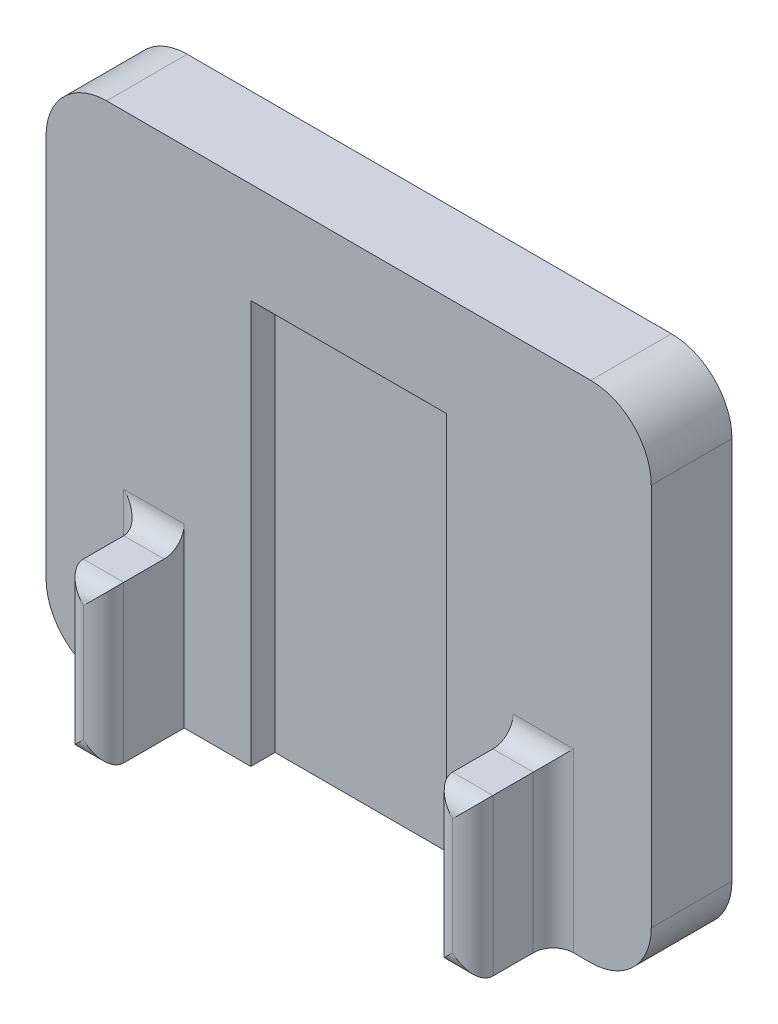
ISO-10303-21;
HEADER;
FILE_DESCRIPTION(('STEP AP214'),'2;1');
FILE_NAME('part.step','',(''),(''),'','','');
FILE_SCHEMA(('AUTOMOTIVE_DESIGN { 1 0 10303 214 1 1 1 1 }'));
ENDSEC;
DATA;
#1=APPLICATION_CONTEXT('core data for automotive mechanical design processes');
#2=APPLICATION_PROTOCOL_DEFINITION('international standard','automotive_design',2000,#1);
#3=PRODUCT_CONTEXT('',#1,'mechanical');
#4=PRODUCT('Part','Part','',(#3));
#5=PRODUCT_RELATED_PRODUCT_CATEGORY('part','',(#4));
#6=PRODUCT_DEFINITION_FORMATION('','',#4);
#7=PRODUCT_DEFINITION_CONTEXT('part definition',#1,'design');
#8=PRODUCT_DEFINITION('design','',#6,#7);
#9=PRODUCT_DEFINITION_SHAPE('','',#8);
#10=(LENGTH_UNIT() NAMED_UNIT(*) SI_UNIT(.MILLI.,.METRE.));
#11=(NAMED_UNIT(*) PLANE_ANGLE_UNIT() SI_UNIT($,.RADIAN.));
#12=(NAMED_UNIT(*) SI_UNIT($,.STERADIAN.) SOLID_ANGLE_UNIT());
#13=UNCERTAINTY_MEASURE_WITH_UNIT(LENGTH_MEASURE(1.E-05),#10,'distance_accuracy_value','');
#14=(GEOMETRIC_REPRESENTATION_CONTEXT(3) GLOBAL_UNCERTAINTY_ASSIGNED_CONTEXT((#13)) GLOBAL_UNIT_ASSIGNED_CONTEXT((#10,
#11,#12)) REPRESENTATION_CONTEXT('',''));
#15=CARTESIAN_POINT('',(0.,0.,0.));
#16=DIRECTION('',(0.,0.,1.));
#17=DIRECTION('',(1.,0.,0.));
#18=AXIS2_PLACEMENT_3D('',#15,#16,#17);
#19=CARTESIAN_POINT('',(0.,0.,4.));
#20=DIRECTION('',(0.,0.,-1.));
#21=DIRECTION('',(-1.,0.,0.));
#22=AXIS2_PLACEMENT_3D('',#19,#20,#21);
#23=PLANE('',#22);
#24=DIRECTION('',(-1.,0.,0.));
#25=VECTOR('',#24,1.);
#26=CARTESIAN_POINT('',(25.15,8.75508155408033,4.));
#27=LINE('',#26,#25);
#28=CARTESIAN_POINT('',(23.15,8.75508155408033,4.));
#29=VERTEX_POINT('',#28);
#30=CARTESIAN_POINT('',(26.15,8.75508155408033,4.));
#31=VERTEX_POINT('',#30);
#32=EDGE_CURVE('E51',#29,#31,#27,.F.);
#33=ORIENTED_EDGE('',*,*,#32,.T.);
#34=DIRECTION('',(0.,1.,0.));
#35=VECTOR('',#34,1.);
#36=CARTESIAN_POINT('',(26.15,0.,4.));
#37=LINE('',#36,#35);
#38=CARTESIAN_POINT('',(26.15,0.,4.));
#39=VERTEX_POINT('',#38);
#40=EDGE_CURVE('E308',#31,#39,#37,.F.);
#41=ORIENTED_EDGE('',*,*,#40,.T.);
#42=DIRECTION('',(1.,0.,0.));
#43=VECTOR('',#42,1.);
#44=CARTESIAN_POINT('',(0.,0.,4.));
#45=LINE('',#44,#43);
#46=CARTESIAN_POINT('',(27.,0.,4.));
#47=VERTEX_POINT('',#46);
#48=EDGE_CURVE('E211',#39,#47,#45,.T.);
#49=ORIENTED_EDGE('',*,*,#48,.T.);
#50=CARTESIAN_POINT('',(27.,3.,4.));
#51=DIRECTION('',(0.,0.,-1.));
#52=DIRECTION('',(-1.,0.,0.));
#53=AXIS2_PLACEMENT_3D('',#50,#51,#52);
#54=CIRCLE('',#53,3.);
#55=CARTESIAN_POINT('',(30.,3.,4.));
#56=VERTEX_POINT('',#55);
#57=EDGE_CURVE('E258',#47,#56,#54,.F.);
#58=ORIENTED_EDGE('',*,*,#57,.T.);
#59=DIRECTION('',(0.,1.,0.));
#60=VECTOR('',#59,1.);
#61=CARTESIAN_POINT('',(30.,0.,4.));
#62=LINE('',#61,#60);
#63=CARTESIAN_POINT('',(30.,22.,4.));
#64=VERTEX_POINT('',#63);
#65=EDGE_CURVE('E216',#56,#64,#62,.T.);
#66=ORIENTED_EDGE('',*,*,#65,.T.);
#67=CARTESIAN_POINT('',(27.,22.,4.));
#68=DIRECTION('',(0.,0.,-1.));
#69=DIRECTION('',(-1.,0.,0.));
#70=AXIS2_PLACEMENT_3D('',#67,#68,#69);
#71=CIRCLE('',#70,3.);
#72=CARTESIAN_POINT('',(27.,25.,4.));
#73=VERTEX_POINT('',#72);
#74=EDGE_CURVE('E261',#64,#73,#71,.F.);
#75=ORIENTED_EDGE('',*,*,#74,.T.);
#76=DIRECTION('',(-1.,0.,0.));
#77=VECTOR('',#76,1.);
#78=CARTESIAN_POINT('',(0.,25.,4.));
#79=LINE('',#78,#77);
#80=CARTESIAN_POINT('',(2.99999999999999,25.,4.));
#81=VERTEX_POINT('',#80);
#82=EDGE_CURVE('E221',#73,#81,#79,.T.);
#83=ORIENTED_EDGE('',*,*,#82,.T.);
#84=CARTESIAN_POINT('',(2.99999999999999,22.,4.));
#85=DIRECTION('',(0.,0.,-1.));
#86=DIRECTION('',(-1.,0.,0.));
#87=AXIS2_PLACEMENT_3D('',#84,#85,#86);
#88=CIRCLE('',#87,3.);
#89=CARTESIAN_POINT('',(0.,22.,4.));
#90=VERTEX_POINT('',#89);
#91=EDGE_CURVE('E267',#81,#90,#88,.F.);
#92=ORIENTED_EDGE('',*,*,#91,.T.);
#93=DIRECTION('',(0.,-1.,0.));
#94=VECTOR('',#93,1.);
#95=CARTESIAN_POINT('',(0.,0.,4.));
#96=LINE('',#95,#94);
#97=CARTESIAN_POINT('',(0.,3.,4.));
#98=VERTEX_POINT('',#97);
#99=EDGE_CURVE('E208',#90,#98,#96,.T.);
#100=ORIENTED_EDGE('',*,*,#99,.T.);
#101=CARTESIAN_POINT('',(3.,3.,4.));
#102=DIRECTION('',(0.,0.,-1.));
#103=DIRECTION('',(-1.,0.,0.));
#104=AXIS2_PLACEMENT_3D('',#101,#102,#103);
#105=CIRCLE('',#104,3.);
#106=CARTESIAN_POINT('',(3.,0.,4.));
#107=VERTEX_POINT('',#106);
#108=EDGE_CURVE('E264',#98,#107,#105,.F.);
#109=ORIENTED_EDGE('',*,*,#108,.T.);
#110=CARTESIAN_POINT('',(3.84999999999999,0.,4.));
#111=VERTEX_POINT('',#110);
#112=EDGE_CURVE('E213',#107,#111,#45,.T.);
#113=ORIENTED_EDGE('',*,*,#112,.T.);
#114=DIRECTION('',(0.,-1.,0.));
#115=VECTOR('',#114,1.);
#116=CARTESIAN_POINT('',(3.84999999999999,7.75508155408033,4.));
#117=LINE('',#116,#115);
#118=CARTESIAN_POINT('',(3.84999999999999,8.75508155408033,4.));
#119=VERTEX_POINT('',#118);
#120=EDGE_CURVE('E303',#111,#119,#117,.F.);
#121=ORIENTED_EDGE('',*,*,#120,.T.);
#122=DIRECTION('',(-1.,0.,0.));
#123=VECTOR('',#122,1.);
#124=CARTESIAN_POINT('',(6.84999999999999,8.75508155408033,4.));
#125=LINE('',#124,#123);
#126=CARTESIAN_POINT('',(6.84999999999999,8.75508155408033,4.));
#127=VERTEX_POINT('',#126);
#128=EDGE_CURVE('E121',#119,#127,#125,.F.);
#129=ORIENTED_EDGE('',*,*,#128,.T.);
#130=DIRECTION('',(0.,1.,0.));
#131=VECTOR('',#130,1.);
#132=CARTESIAN_POINT('',(6.84999999999999,0.,4.));
#133=LINE('',#132,#131);
#134=CARTESIAN_POINT('',(6.84999999999999,0.,4.));
#135=VERTEX_POINT('',#134);
#136=EDGE_CURVE('E330',#135,#127,#133,.T.);
#137=ORIENTED_EDGE('',*,*,#136,.F.);
#138=CARTESIAN_POINT('',(10.15,0.,4.));
#139=VERTEX_POINT('',#138);
#140=EDGE_CURVE('E217',#135,#139,#45,.T.);
#141=ORIENTED_EDGE('',*,*,#140,.T.);
#142=DIRECTION('',(0.,-1.,0.));
#143=VECTOR('',#142,1.);
#144=CARTESIAN_POINT('',(10.15,0.,4.));
#145=LINE('',#144,#143);
#146=CARTESIAN_POINT('',(10.15,20.,4.));
#147=VERTEX_POINT('',#146);
#148=EDGE_CURVE('E179',#147,#139,#145,.T.);
#149=ORIENTED_EDGE('',*,*,#148,.F.);
#150=DIRECTION('',(-1.,0.,0.));
#151=VECTOR('',#150,1.);
#152=CARTESIAN_POINT('',(19.85,20.,4.));
#153=LINE('',#152,#151);
#154=CARTESIAN_POINT('',(19.85,20.,4.));
#155=VERTEX_POINT('',#154);
#156=EDGE_CURVE('E191',#155,#147,#153,.T.);
#157=ORIENTED_EDGE('',*,*,#156,.F.);
#158=DIRECTION('',(0.,1.,0.));
#159=VECTOR('',#158,1.);
#160=CARTESIAN_POINT('',(19.85,0.,4.));
#161=LINE('',#160,#159);
#162=CARTESIAN_POINT('',(19.85,0.,4.));
#163=VERTEX_POINT('',#162);
#164=EDGE_CURVE('E174',#163,#155,#161,.T.);
#165=ORIENTED_EDGE('',*,*,#164,.F.);
#166=CARTESIAN_POINT('',(23.15,0.,4.));
#167=VERTEX_POINT('',#166);
#168=EDGE_CURVE('E218',#163,#167,#45,.T.);
#169=ORIENTED_EDGE('',*,*,#168,.T.);
#170=DIRECTION('',(0.,-1.,0.));
#171=VECTOR('',#170,1.);
#172=CARTESIAN_POINT('',(23.15,0.,4.));
#173=LINE('',#172,#171);
#174=EDGE_CURVE('E154',#29,#167,#173,.T.);
#175=ORIENTED_EDGE('',*,*,#174,.F.);
#176=EDGE_LOOP('',(#33,#41,#49,#58,#66,#75,#83,#92,#100,#109,#113,#121,#129,#137,#141,#149,#157,
#165,#169,#175));
#177=FACE_BOUND('',#176,.T.);
#178=ADVANCED_FACE('F32',(#177),#23,.F.);
#179=CARTESIAN_POINT('',(0.,0.,4.));
#180=DIRECTION('',(1.,0.,0.));
#181=DIRECTION('',(0.,1.,0.));
#182=AXIS2_PLACEMENT_3D('',#179,#180,#181);
#183=PLANE('',#182);
#184=ORIENTED_EDGE('',*,*,#99,.F.);
#185=DIRECTION('',(0.,0.,-1.));
#186=VECTOR('',#185,1.);
#187=CARTESIAN_POINT('',(0.,22.,4.));
#188=LINE('',#187,#186);
#189=CARTESIAN_POINT('',(0.,22.,0.));
#190=VERTEX_POINT('',#189);
#191=EDGE_CURVE('E237',#90,#190,#188,.T.);
#192=ORIENTED_EDGE('',*,*,#191,.T.);
#193=DIRECTION('',(0.,-1.,0.));
#194=VECTOR('',#193,1.);
#195=CARTESIAN_POINT('',(0.,0.,0.));
#196=LINE('',#195,#194);
#197=CARTESIAN_POINT('',(0.,3.,0.));
#198=VERTEX_POINT('',#197);
#199=EDGE_CURVE('E199',#190,#198,#196,.T.);
#200=ORIENTED_EDGE('',*,*,#199,.T.);
#201=DIRECTION('',(0.,0.,-1.));
#202=VECTOR('',#201,1.);
#203=CARTESIAN_POINT('',(0.,3.,4.));
#204=LINE('',#203,#202);
#205=EDGE_CURVE('E224',#198,#98,#204,.F.);
#206=ORIENTED_EDGE('',*,*,#205,.T.);
#207=EDGE_LOOP('',(#184,#192,#200,#206));
#208=FACE_BOUND('',#207,.T.);
#209=ADVANCED_FACE('F462',(#208),#183,.F.);
#210=CARTESIAN_POINT('',(0.,0.,4.));
#211=DIRECTION('',(0.,1.,0.));
#212=DIRECTION('',(0.,0.,1.));
#213=AXIS2_PLACEMENT_3D('',#210,#211,#212);
#214=PLANE('',#213);
#215=DIRECTION('',(0.,0.,-1.));
#216=VECTOR('',#215,1.);
#217=CARTESIAN_POINT('',(6.84999999999999,0.,8.));
#218=LINE('',#217,#216);
#219=CARTESIAN_POINT('',(6.84999999999999,0.,7.));
#220=VERTEX_POINT('',#219);
#221=EDGE_CURVE('E156',#220,#135,#218,.T.);
#222=ORIENTED_EDGE('',*,*,#221,.F.);
#223=DIRECTION('',(1.,0.,0.));
#224=VECTOR('',#223,1.);
#225=CARTESIAN_POINT('',(4.84999999999999,0.,7.));
#226=LINE('',#225,#224);
#227=CARTESIAN_POINT('',(4.84999999999999,0.,7.));
#228=VERTEX_POINT('',#227);
#229=EDGE_CURVE('E136',#220,#228,#226,.F.);
#230=ORIENTED_EDGE('',*,*,#229,.T.);
#231=DIRECTION('',(0.,0.,-1.));
#232=VECTOR('',#231,1.);
#233=CARTESIAN_POINT('',(4.84999999999999,0.,8.));
#234=LINE('',#233,#232);
#235=CARTESIAN_POINT('',(4.84999999999999,0.,5.));
#236=VERTEX_POINT('',#235);
#237=EDGE_CURVE('E152',#228,#236,#234,.T.);
#238=ORIENTED_EDGE('',*,*,#237,.T.);
#239=CARTESIAN_POINT('',(3.84999999999999,0.,5.));
#240=DIRECTION('',(0.,1.,0.));
#241=DIRECTION('',(0.,0.,1.));
#242=AXIS2_PLACEMENT_3D('',#239,#240,#241);
#243=CIRCLE('',#242,1.);
#244=EDGE_CURVE('E11',#236,#111,#243,.T.);
#245=ORIENTED_EDGE('',*,*,#244,.T.);
#246=ORIENTED_EDGE('',*,*,#112,.F.);
#247=DIRECTION('',(0.,0.,-1.));
#248=VECTOR('',#247,1.);
#249=CARTESIAN_POINT('',(3.,0.,4.));
#250=LINE('',#249,#248);
#251=CARTESIAN_POINT('',(3.,0.,0.));
#252=VERTEX_POINT('',#251);
#253=EDGE_CURVE('E273',#107,#252,#250,.T.);
#254=ORIENTED_EDGE('',*,*,#253,.T.);
#255=DIRECTION('',(1.,0.,0.));
#256=VECTOR('',#255,1.);
#257=CARTESIAN_POINT('',(0.,0.,0.));
#258=LINE('',#257,#256);
#259=CARTESIAN_POINT('',(27.,0.,0.));
#260=VERTEX_POINT('',#259);
#261=EDGE_CURVE('E227',#252,#260,#258,.T.);
#262=ORIENTED_EDGE('',*,*,#261,.T.);
#263=DIRECTION('',(0.,0.,-1.));
#264=VECTOR('',#263,1.);
#265=CARTESIAN_POINT('',(27.,0.,4.));
#266=LINE('',#265,#264);
#267=EDGE_CURVE('E270',#260,#47,#266,.F.);
#268=ORIENTED_EDGE('',*,*,#267,.T.);
#269=ORIENTED_EDGE('',*,*,#48,.F.);
#270=CARTESIAN_POINT('',(26.15,0.,5.));
#271=DIRECTION('',(0.,1.,0.));
#272=DIRECTION('',(0.,0.,1.));
#273=AXIS2_PLACEMENT_3D('',#270,#271,#272);
#274=CIRCLE('',#273,1.);
#275=CARTESIAN_POINT('',(25.15,0.,5.));
#276=VERTEX_POINT('',#275);
#277=EDGE_CURVE('E310',#39,#276,#274,.T.);
#278=ORIENTED_EDGE('',*,*,#277,.T.);
#279=DIRECTION('',(0.,0.,-1.));
#280=VECTOR('',#279,1.);
#281=CARTESIAN_POINT('',(25.15,0.,8.));
#282=LINE('',#281,#280);
#283=CARTESIAN_POINT('',(25.15,0.,7.));
#284=VERTEX_POINT('',#283);
#285=EDGE_CURVE('E168',#284,#276,#282,.T.);
#286=ORIENTED_EDGE('',*,*,#285,.F.);
#287=DIRECTION('',(1.,0.,0.));
#288=VECTOR('',#287,1.);
#289=CARTESIAN_POINT('',(0.,0.,7.));
#290=LINE('',#289,#288);
#291=CARTESIAN_POINT('',(23.15,0.,7.));
#292=VERTEX_POINT('',#291);
#293=EDGE_CURVE('E83',#284,#292,#290,.F.);
#294=ORIENTED_EDGE('',*,*,#293,.T.);
#295=DIRECTION('',(0.,0.,-1.));
#296=VECTOR('',#295,1.);
#297=CARTESIAN_POINT('',(23.15,0.,8.));
#298=LINE('',#297,#296);
#299=EDGE_CURVE('E171',#292,#167,#298,.T.);
#300=ORIENTED_EDGE('',*,*,#299,.T.);
#301=ORIENTED_EDGE('',*,*,#168,.F.);
#302=DIRECTION('',(0.,0.,1.));
#303=VECTOR('',#302,1.);
#304=CARTESIAN_POINT('',(19.85,0.,2.8));
#305=LINE('',#304,#303);
#306=CARTESIAN_POINT('',(19.85,0.,2.8));
#307=VERTEX_POINT('',#306);
#308=EDGE_CURVE('E196',#307,#163,#305,.T.);
#309=ORIENTED_EDGE('',*,*,#308,.F.);
#310=DIRECTION('',(1.,0.,0.));
#311=VECTOR('',#310,1.);
#312=CARTESIAN_POINT('',(19.85,0.,2.8));
#313=LINE('',#312,#311);
#314=CARTESIAN_POINT('',(10.15,0.,2.8));
#315=VERTEX_POINT('',#314);
#316=EDGE_CURVE('E185',#315,#307,#313,.T.);
#317=ORIENTED_EDGE('',*,*,#316,.F.);
#318=DIRECTION('',(0.,0.,1.));
#319=VECTOR('',#318,1.);
#320=CARTESIAN_POINT('',(10.15,0.,2.8));
#321=LINE('',#320,#319);
#322=EDGE_CURVE('E200',#315,#139,#321,.T.);
#323=ORIENTED_EDGE('',*,*,#322,.T.);
#324=ORIENTED_EDGE('',*,*,#140,.F.);
#325=EDGE_LOOP('',(#222,#230,#238,#245,#246,#254,#262,#268,#269,#278,#286,#294,#300,#301,#309,
#317,#323,#324));
#326=FACE_BOUND('',#325,.T.);
#327=ADVANCED_FACE('F348',(#326),#214,.F.);
#328=CARTESIAN_POINT('',(30.,0.,4.));
#329=DIRECTION('',(-1.,0.,0.));
#330=DIRECTION('',(0.,-1.,0.));
#331=AXIS2_PLACEMENT_3D('',#328,#329,#330);
#332=PLANE('',#331);
#333=DIRECTION('',(0.,1.,0.));
#334=VECTOR('',#333,1.);
#335=CARTESIAN_POINT('',(30.,0.,0.));
#336=LINE('',#335,#334);
#337=CARTESIAN_POINT('',(30.,3.,0.));
#338=VERTEX_POINT('',#337);
#339=CARTESIAN_POINT('',(30.,22.,0.));
#340=VERTEX_POINT('',#339);
#341=EDGE_CURVE('E230',#338,#340,#336,.T.);
#342=ORIENTED_EDGE('',*,*,#341,.T.);
#343=DIRECTION('',(0.,0.,-1.));
#344=VECTOR('',#343,1.);
#345=CARTESIAN_POINT('',(30.,22.,4.));
#346=LINE('',#345,#344);
#347=EDGE_CURVE('E279',#340,#64,#346,.F.);
#348=ORIENTED_EDGE('',*,*,#347,.T.);
#349=ORIENTED_EDGE('',*,*,#65,.F.);
#350=DIRECTION('',(0.,0.,-1.));
#351=VECTOR('',#350,1.);
#352=CARTESIAN_POINT('',(30.,3.,4.));
#353=LINE('',#352,#351);
#354=EDGE_CURVE('E276',#56,#338,#353,.T.);
#355=ORIENTED_EDGE('',*,*,#354,.T.);
#356=EDGE_LOOP('',(#342,#348,#349,#355));
#357=FACE_BOUND('',#356,.T.);
#358=ADVANCED_FACE('F479',(#357),#332,.F.);
#359=CARTESIAN_POINT('',(0.,25.,4.));
#360=DIRECTION('',(0.,-1.,0.));
#361=DIRECTION('',(0.,0.,-1.));
#362=AXIS2_PLACEMENT_3D('',#359,#360,#361);
#363=PLANE('',#362);
#364=DIRECTION('',(-1.,0.,0.));
#365=VECTOR('',#364,1.);
#366=CARTESIAN_POINT('',(0.,25.,0.));
#367=LINE('',#366,#365);
#368=CARTESIAN_POINT('',(27.,25.,0.));
#369=VERTEX_POINT('',#368);
#370=CARTESIAN_POINT('',(2.99999999999999,25.,0.));
#371=VERTEX_POINT('',#370);
#372=EDGE_CURVE('E212',#369,#371,#367,.T.);
#373=ORIENTED_EDGE('',*,*,#372,.T.);
#374=DIRECTION('',(0.,0.,-1.));
#375=VECTOR('',#374,1.);
#376=CARTESIAN_POINT('',(2.99999999999999,25.,4.));
#377=LINE('',#376,#375);
#378=EDGE_CURVE('E255',#371,#81,#377,.F.);
#379=ORIENTED_EDGE('',*,*,#378,.T.);
#380=ORIENTED_EDGE('',*,*,#82,.F.);
#381=DIRECTION('',(0.,0.,-1.));
#382=VECTOR('',#381,1.);
#383=CARTESIAN_POINT('',(27.,25.,4.));
#384=LINE('',#383,#382);
#385=EDGE_CURVE('E252',#73,#369,#384,.T.);
#386=ORIENTED_EDGE('',*,*,#385,.T.);
#387=EDGE_LOOP('',(#373,#379,#380,#386));
#388=FACE_BOUND('',#387,.T.);
#389=ADVANCED_FACE('F475',(#388),#363,.F.);
#390=CARTESIAN_POINT('',(0.,0.,0.));
#391=DIRECTION('',(0.,0.,-1.));
#392=DIRECTION('',(-1.,0.,0.));
#393=AXIS2_PLACEMENT_3D('',#390,#391,#392);
#394=PLANE('',#393);
#395=ORIENTED_EDGE('',*,*,#199,.F.);
#396=CARTESIAN_POINT('',(2.99999999999999,22.,0.));
#397=DIRECTION('',(0.,0.,-1.));
#398=DIRECTION('',(-1.,0.,0.));
#399=AXIS2_PLACEMENT_3D('',#396,#397,#398);
#400=CIRCLE('',#399,3.);
#401=EDGE_CURVE('E249',#190,#371,#400,.T.);
#402=ORIENTED_EDGE('',*,*,#401,.T.);
#403=ORIENTED_EDGE('',*,*,#372,.F.);
#404=CARTESIAN_POINT('',(27.,22.,0.));
#405=DIRECTION('',(0.,0.,-1.));
#406=DIRECTION('',(-1.,0.,0.));
#407=AXIS2_PLACEMENT_3D('',#404,#405,#406);
#408=CIRCLE('',#407,3.);
#409=EDGE_CURVE('E243',#369,#340,#408,.T.);
#410=ORIENTED_EDGE('',*,*,#409,.T.);
#411=ORIENTED_EDGE('',*,*,#341,.F.);
#412=CARTESIAN_POINT('',(27.,3.,0.));
#413=DIRECTION('',(0.,0.,-1.));
#414=DIRECTION('',(-1.,0.,0.));
#415=AXIS2_PLACEMENT_3D('',#412,#413,#414);
#416=CIRCLE('',#415,3.);
#417=EDGE_CURVE('E240',#338,#260,#416,.T.);
#418=ORIENTED_EDGE('',*,*,#417,.T.);
#419=ORIENTED_EDGE('',*,*,#261,.F.);
#420=CARTESIAN_POINT('',(3.,3.,0.));
#421=DIRECTION('',(0.,0.,-1.));
#422=DIRECTION('',(-1.,0.,0.));
#423=AXIS2_PLACEMENT_3D('',#420,#421,#422);
#424=CIRCLE('',#423,3.);
#425=EDGE_CURVE('E246',#252,#198,#424,.T.);
#426=ORIENTED_EDGE('',*,*,#425,.T.);
#427=EDGE_LOOP('',(#395,#402,#403,#410,#411,#418,#419,#426));
#428=FACE_BOUND('',#427,.T.);
#429=ADVANCED_FACE('F472',(#428),#394,.T.);
#430=CARTESIAN_POINT('',(19.85,0.,2.8));
#431=DIRECTION('',(1.,0.,0.));
#432=DIRECTION('',(0.,1.,0.));
#433=AXIS2_PLACEMENT_3D('',#430,#431,#432);
#434=PLANE('',#433);
#435=ORIENTED_EDGE('',*,*,#164,.T.);
#436=DIRECTION('',(0.,0.,1.));
#437=VECTOR('',#436,1.);
#438=CARTESIAN_POINT('',(19.85,20.,2.8));
#439=LINE('',#438,#437);
#440=CARTESIAN_POINT('',(19.85,20.,2.8));
#441=VERTEX_POINT('',#440);
#442=EDGE_CURVE('E188',#441,#155,#439,.T.);
#443=ORIENTED_EDGE('',*,*,#442,.F.);
#444=DIRECTION('',(0.,1.,0.));
#445=VECTOR('',#444,1.);
#446=CARTESIAN_POINT('',(19.85,0.,2.8));
#447=LINE('',#446,#445);
#448=EDGE_CURVE('E175',#307,#441,#447,.T.);
#449=ORIENTED_EDGE('',*,*,#448,.F.);
#450=ORIENTED_EDGE('',*,*,#308,.T.);
#451=EDGE_LOOP('',(#435,#443,#449,#450));
#452=FACE_BOUND('',#451,.T.);
#453=ADVANCED_FACE('F470',(#452),#434,.F.);
#454=CARTESIAN_POINT('',(10.15,0.,2.8));
#455=DIRECTION('',(-1.,0.,0.));
#456=DIRECTION('',(0.,0.,1.));
#457=AXIS2_PLACEMENT_3D('',#454,#455,#456);
#458=PLANE('',#457);
#459=ORIENTED_EDGE('',*,*,#148,.T.);
#460=ORIENTED_EDGE('',*,*,#322,.F.);
#461=DIRECTION('',(0.,-1.,0.));
#462=VECTOR('',#461,1.);
#463=CARTESIAN_POINT('',(10.15,0.,2.8));
#464=LINE('',#463,#462);
#465=CARTESIAN_POINT('',(10.15,20.,2.8));
#466=VERTEX_POINT('',#465);
#467=EDGE_CURVE('E182',#466,#315,#464,.T.);
#468=ORIENTED_EDGE('',*,*,#467,.F.);
#469=DIRECTION('',(0.,0.,1.));
#470=VECTOR('',#469,1.);
#471=CARTESIAN_POINT('',(10.15,20.,2.8));
#472=LINE('',#471,#470);
#473=EDGE_CURVE('E203',#466,#147,#472,.T.);
#474=ORIENTED_EDGE('',*,*,#473,.T.);
#475=EDGE_LOOP('',(#459,#460,#468,#474));
#476=FACE_BOUND('',#475,.T.);
#477=ADVANCED_FACE('F708',(#476),#458,.F.);
#478=CARTESIAN_POINT('',(19.85,20.,2.8));
#479=DIRECTION('',(0.,1.,0.));
#480=DIRECTION('',(-1.,0.,0.));
#481=AXIS2_PLACEMENT_3D('',#478,#479,#480);
#482=PLANE('',#481);
#483=ORIENTED_EDGE('',*,*,#156,.T.);
#484=ORIENTED_EDGE('',*,*,#473,.F.);
#485=DIRECTION('',(-1.,0.,0.));
#486=VECTOR('',#485,1.);
#487=CARTESIAN_POINT('',(19.85,20.,2.8));
#488=LINE('',#487,#486);
#489=EDGE_CURVE('E178',#441,#466,#488,.T.);
#490=ORIENTED_EDGE('',*,*,#489,.F.);
#491=ORIENTED_EDGE('',*,*,#442,.T.);
#492=EDGE_LOOP('',(#483,#484,#490,#491));
#493=FACE_BOUND('',#492,.T.);
#494=ADVANCED_FACE('F698',(#493),#482,.F.);
#495=CARTESIAN_POINT('',(0.,0.,2.8));
#496=DIRECTION('',(0.,0.,1.));
#497=DIRECTION('',(1.,0.,0.));
#498=AXIS2_PLACEMENT_3D('',#495,#496,#497);
#499=PLANE('',#498);
#500=ORIENTED_EDGE('',*,*,#448,.T.);
#501=ORIENTED_EDGE('',*,*,#489,.T.);
#502=ORIENTED_EDGE('',*,*,#467,.T.);
#503=ORIENTED_EDGE('',*,*,#316,.T.);
#504=EDGE_LOOP('',(#500,#501,#502,#503));
#505=FACE_BOUND('',#504,.T.);
#506=ADVANCED_FACE('F489',(#505),#499,.T.);
#507=CARTESIAN_POINT('',(2.99999999999999,22.,4.));
#508=DIRECTION('',(0.,0.,-1.));
#509=DIRECTION('',(-1.,0.,0.));
#510=AXIS2_PLACEMENT_3D('',#507,#508,#509);
#511=CYLINDRICAL_SURFACE('',#510,3.);
#512=ORIENTED_EDGE('',*,*,#91,.F.);
#513=ORIENTED_EDGE('',*,*,#378,.F.);
#514=ORIENTED_EDGE('',*,*,#401,.F.);
#515=ORIENTED_EDGE('',*,*,#191,.F.);
#516=EDGE_LOOP('',(#512,#513,#514,#515));
#517=FACE_BOUND('',#516,.T.);
#518=ADVANCED_FACE('F486',(#517),#511,.T.);
#519=CARTESIAN_POINT('',(3.,3.,4.));
#520=DIRECTION('',(0.,0.,-1.));
#521=DIRECTION('',(-1.,0.,0.));
#522=AXIS2_PLACEMENT_3D('',#519,#520,#521);
#523=CYLINDRICAL_SURFACE('',#522,3.);
#524=ORIENTED_EDGE('',*,*,#108,.F.);
#525=ORIENTED_EDGE('',*,*,#205,.F.);
#526=ORIENTED_EDGE('',*,*,#425,.F.);
#527=ORIENTED_EDGE('',*,*,#253,.F.);
#528=EDGE_LOOP('',(#524,#525,#526,#527));
#529=FACE_BOUND('',#528,.T.);
#530=ADVANCED_FACE('F406',(#529),#523,.T.);
#531=CARTESIAN_POINT('',(27.,22.,4.));
#532=DIRECTION('',(0.,0.,-1.));
#533=DIRECTION('',(-1.,0.,0.));
#534=AXIS2_PLACEMENT_3D('',#531,#532,#533);
#535=CYLINDRICAL_SURFACE('',#534,3.);
#536=ORIENTED_EDGE('',*,*,#74,.F.);
#537=ORIENTED_EDGE('',*,*,#347,.F.);
#538=ORIENTED_EDGE('',*,*,#409,.F.);
#539=ORIENTED_EDGE('',*,*,#385,.F.);
#540=EDGE_LOOP('',(#536,#537,#538,#539));
#541=FACE_BOUND('',#540,.T.);
#542=ADVANCED_FACE('F493',(#541),#535,.T.);
#543=CARTESIAN_POINT('',(27.,3.,4.));
#544=DIRECTION('',(0.,0.,-1.));
#545=DIRECTION('',(-1.,0.,0.));
#546=AXIS2_PLACEMENT_3D('',#543,#544,#545);
#547=CYLINDRICAL_SURFACE('',#546,3.);
#548=ORIENTED_EDGE('',*,*,#57,.F.);
#549=ORIENTED_EDGE('',*,*,#267,.F.);
#550=ORIENTED_EDGE('',*,*,#417,.F.);
#551=ORIENTED_EDGE('',*,*,#354,.F.);
#552=EDGE_LOOP('',(#548,#549,#550,#551));
#553=FACE_BOUND('',#552,.T.);
#554=ADVANCED_FACE('F496',(#553),#547,.T.);
#555=CARTESIAN_POINT('',(23.15,0.,8.));
#556=DIRECTION('',(1.,0.,0.));
#557=DIRECTION('',(0.,0.,-1.));
#558=AXIS2_PLACEMENT_3D('',#555,#556,#557);
#559=PLANE('',#558);
#560=ORIENTED_EDGE('',*,*,#299,.F.);
#561=DIRECTION('',(0.,-1.,0.));
#562=VECTOR('',#561,1.);
#563=CARTESIAN_POINT('',(23.15,0.,7.));
#564=LINE('',#563,#562);
#565=CARTESIAN_POINT('',(23.15,7.75508155408033,7.));
#566=VERTEX_POINT('',#565);
#567=EDGE_CURVE('E95',#292,#566,#564,.F.);
#568=ORIENTED_EDGE('',*,*,#567,.T.);
#569=DIRECTION('',(0.,0.,-1.));
#570=VECTOR('',#569,1.);
#571=CARTESIAN_POINT('',(23.15,7.75508155408033,8.));
#572=LINE('',#571,#570);
#573=CARTESIAN_POINT('',(23.15,7.75508155408033,5.));
#574=VERTEX_POINT('',#573);
#575=EDGE_CURVE('E162',#566,#574,#572,.T.);
#576=ORIENTED_EDGE('',*,*,#575,.T.);
#577=CARTESIAN_POINT('',(23.15,8.75508155408033,5.));
#578=DIRECTION('',(1.,0.,0.));
#579=DIRECTION('',(0.,0.,-1.));
#580=AXIS2_PLACEMENT_3D('',#577,#578,#579);
#581=CIRCLE('',#580,1.);
#582=EDGE_CURVE('E313',#574,#29,#581,.T.);
#583=ORIENTED_EDGE('',*,*,#582,.T.);
#584=ORIENTED_EDGE('',*,*,#174,.T.);
#585=EDGE_LOOP('',(#560,#568,#576,#583,#584));
#586=FACE_BOUND('',#585,.T.);
#587=ADVANCED_FACE('F449',(#586),#559,.F.);
#588=CARTESIAN_POINT('',(25.15,0.,8.));
#589=DIRECTION('',(-1.,0.,0.));
#590=DIRECTION('',(0.,0.,1.));
#591=AXIS2_PLACEMENT_3D('',#588,#589,#590);
#592=PLANE('',#591);
#593=DIRECTION('',(0.,0.,-1.));
#594=VECTOR('',#593,1.);
#595=CARTESIAN_POINT('',(25.15,7.75508155408033,8.));
#596=LINE('',#595,#594);
#597=CARTESIAN_POINT('',(25.15,7.75508155408033,7.));
#598=VERTEX_POINT('',#597);
#599=CARTESIAN_POINT('',(25.15,7.75508155408033,5.));
#600=VERTEX_POINT('',#599);
#601=EDGE_CURVE('E165',#598,#600,#596,.T.);
#602=ORIENTED_EDGE('',*,*,#601,.F.);
#603=DIRECTION('',(0.,1.,0.));
#604=VECTOR('',#603,1.);
#605=CARTESIAN_POINT('',(25.15,0.,7.));
#606=LINE('',#605,#604);
#607=EDGE_CURVE('E299',#598,#284,#606,.F.);
#608=ORIENTED_EDGE('',*,*,#607,.T.);
#609=ORIENTED_EDGE('',*,*,#285,.T.);
#610=DIRECTION('',(0.,1.,0.));
#611=VECTOR('',#610,1.);
#612=CARTESIAN_POINT('',(25.15,7.75508155408033,5.));
#613=LINE('',#612,#611);
#614=EDGE_CURVE('E296',#276,#600,#613,.T.);
#615=ORIENTED_EDGE('',*,*,#614,.T.);
#616=EDGE_LOOP('',(#602,#608,#609,#615));
#617=FACE_BOUND('',#616,.T.);
#618=ADVANCED_FACE('F373',(#617),#592,.F.);
#619=CARTESIAN_POINT('',(23.15,7.75508155408033,8.));
#620=DIRECTION('',(0.,-1.,0.));
#621=DIRECTION('',(0.,0.,-1.));
#622=AXIS2_PLACEMENT_3D('',#619,#620,#621);
#623=PLANE('',#622);
#624=ORIENTED_EDGE('',*,*,#575,.F.);
#625=DIRECTION('',(-1.,0.,0.));
#626=VECTOR('',#625,1.);
#627=CARTESIAN_POINT('',(23.15,7.75508155408033,7.));
#628=LINE('',#627,#626);
#629=EDGE_CURVE('E293',#566,#598,#628,.F.);
#630=ORIENTED_EDGE('',*,*,#629,.T.);
#631=ORIENTED_EDGE('',*,*,#601,.T.);
#632=DIRECTION('',(-1.,0.,0.));
#633=VECTOR('',#632,1.);
#634=CARTESIAN_POINT('',(23.15,7.75508155408033,5.));
#635=LINE('',#634,#633);
#636=EDGE_CURVE('E290',#600,#574,#635,.T.);
#637=ORIENTED_EDGE('',*,*,#636,.T.);
#638=EDGE_LOOP('',(#624,#630,#631,#637));
#639=FACE_BOUND('',#638,.T.);
#640=ADVANCED_FACE('F372',(#639),#623,.F.);
#641=CARTESIAN_POINT('',(6.84999999999999,0.,8.));
#642=DIRECTION('',(-1.,0.,0.));
#643=DIRECTION('',(0.,0.,1.));
#644=AXIS2_PLACEMENT_3D('',#641,#642,#643);
#645=PLANE('',#644);
#646=DIRECTION('',(0.,0.,-1.));
#647=VECTOR('',#646,1.);
#648=CARTESIAN_POINT('',(6.84999999999999,7.75508155408033,8.));
#649=LINE('',#648,#647);
#650=CARTESIAN_POINT('',(6.84999999999999,7.75508155408033,7.));
#651=VERTEX_POINT('',#650);
#652=CARTESIAN_POINT('',(6.84999999999999,7.75508155408033,5.));
#653=VERTEX_POINT('',#652);
#654=EDGE_CURVE('E146',#651,#653,#649,.T.);
#655=ORIENTED_EDGE('',*,*,#654,.F.);
#656=DIRECTION('',(0.,1.,0.));
#657=VECTOR('',#656,1.);
#658=CARTESIAN_POINT('',(6.84999999999999,0.,7.));
#659=LINE('',#658,#657);
#660=EDGE_CURVE('E287',#651,#220,#659,.F.);
#661=ORIENTED_EDGE('',*,*,#660,.T.);
#662=ORIENTED_EDGE('',*,*,#221,.T.);
#663=ORIENTED_EDGE('',*,*,#136,.T.);
#664=CARTESIAN_POINT('',(6.84999999999999,8.75508155408033,5.));
#665=DIRECTION('',(-1.,0.,0.));
#666=DIRECTION('',(0.,0.,1.));
#667=AXIS2_PLACEMENT_3D('',#664,#665,#666);
#668=CIRCLE('',#667,1.);
#669=EDGE_CURVE('E42',#127,#653,#668,.T.);
#670=ORIENTED_EDGE('',*,*,#669,.T.);
#671=EDGE_LOOP('',(#655,#661,#662,#663,#670));
#672=FACE_BOUND('',#671,.T.);
#673=ADVANCED_FACE('F340',(#672),#645,.F.);
#674=CARTESIAN_POINT('',(6.84999999999999,7.75508155408033,8.));
#675=DIRECTION('',(0.,-1.,0.));
#676=DIRECTION('',(0.,0.,-1.));
#677=AXIS2_PLACEMENT_3D('',#674,#675,#676);
#678=PLANE('',#677);
#679=DIRECTION('',(0.,0.,-1.));
#680=VECTOR('',#679,1.);
#681=CARTESIAN_POINT('',(4.84999999999999,7.75508155408033,8.));
#682=LINE('',#681,#680);
#683=CARTESIAN_POINT('',(4.84999999999999,7.75508155408033,7.));
#684=VERTEX_POINT('',#683);
#685=CARTESIAN_POINT('',(4.84999999999999,7.75508155408033,5.));
#686=VERTEX_POINT('',#685);
#687=EDGE_CURVE('E143',#684,#686,#682,.T.);
#688=ORIENTED_EDGE('',*,*,#687,.F.);
#689=DIRECTION('',(-1.,0.,0.));
#690=VECTOR('',#689,1.);
#691=CARTESIAN_POINT('',(6.84999999999999,7.75508155408033,7.));
#692=LINE('',#691,#690);
#693=EDGE_CURVE('E147',#684,#651,#692,.F.);
#694=ORIENTED_EDGE('',*,*,#693,.T.);
#695=ORIENTED_EDGE('',*,*,#654,.T.);
#696=DIRECTION('',(-1.,0.,0.));
#697=VECTOR('',#696,1.);
#698=CARTESIAN_POINT('',(4.84999999999999,7.75508155408033,5.));
#699=LINE('',#698,#697);
#700=EDGE_CURVE('E118',#653,#686,#699,.T.);
#701=ORIENTED_EDGE('',*,*,#700,.T.);
#702=EDGE_LOOP('',(#688,#694,#695,#701));
#703=FACE_BOUND('',#702,.T.);
#704=ADVANCED_FACE('F141',(#703),#678,.F.);
#705=CARTESIAN_POINT('',(4.84999999999999,0.,8.));
#706=DIRECTION('',(1.,0.,0.));
#707=DIRECTION('',(0.,0.,-1.));
#708=AXIS2_PLACEMENT_3D('',#705,#706,#707);
#709=PLANE('',#708);
#710=ORIENTED_EDGE('',*,*,#237,.F.);
#711=DIRECTION('',(0.,-1.,0.));
#712=VECTOR('',#711,1.);
#713=CARTESIAN_POINT('',(4.84999999999999,7.75508155408033,7.));
#714=LINE('',#713,#712);
#715=EDGE_CURVE('E135',#228,#684,#714,.F.);
#716=ORIENTED_EDGE('',*,*,#715,.T.);
#717=ORIENTED_EDGE('',*,*,#687,.T.);
#718=DIRECTION('',(0.,-1.,0.));
#719=VECTOR('',#718,1.);
#720=CARTESIAN_POINT('',(4.84999999999999,0.,5.));
#721=LINE('',#720,#719);
#722=EDGE_CURVE('E129',#686,#236,#721,.T.);
#723=ORIENTED_EDGE('',*,*,#722,.T.);
#724=EDGE_LOOP('',(#710,#716,#717,#723));
#725=FACE_BOUND('',#724,.T.);
#726=ADVANCED_FACE('F150',(#725),#709,.F.);
#727=CARTESIAN_POINT('',(0.,6.75508155408033,7.));
#728=DIRECTION('',(1.,0.,0.));
#729=DIRECTION('',(0.,0.,-1.));
#730=AXIS2_PLACEMENT_3D('',#727,#728,#729);
#731=CYLINDRICAL_SURFACE('',#730,1.);
#732=CARTESIAN_POINT('',(5.84999999999999,6.75508155408033,7.));
#733=DIRECTION('',(0.707106781186547,-0.707106781186547,0.));
#734=DIRECTION('',(-0.707106781186547,-0.707106781186547,0.));
#735=AXIS2_PLACEMENT_3D('',#732,#733,#734);
#736=ELLIPSE('',#735,1.41421356237309,1.);
#737=CARTESIAN_POINT('',(5.84999999999999,6.75508155408033,8.));
#738=VERTEX_POINT('',#737);
#739=EDGE_CURVE('E323',#651,#738,#736,.T.);
#740=ORIENTED_EDGE('',*,*,#739,.F.);
#741=ORIENTED_EDGE('',*,*,#693,.F.);
#742=CARTESIAN_POINT('',(5.84999999999999,6.75508155408033,7.));
#743=DIRECTION('',(0.707106781186547,0.707106781186547,0.));
#744=DIRECTION('',(0.707106781186547,-0.707106781186547,0.));
#745=AXIS2_PLACEMENT_3D('',#742,#743,#744);
#746=ELLIPSE('',#745,1.41421356237309,1.);
#747=EDGE_CURVE('E328',#738,#684,#746,.F.);
#748=ORIENTED_EDGE('',*,*,#747,.F.);
#749=EDGE_LOOP('',(#740,#741,#748));
#750=FACE_BOUND('',#749,.T.);
#751=ADVANCED_FACE('F509',(#750),#731,.T.);
#752=CARTESIAN_POINT('',(5.84999999999999,0.,7.));
#753=DIRECTION('',(0.,1.,0.));
#754=DIRECTION('',(0.,0.,1.));
#755=AXIS2_PLACEMENT_3D('',#752,#753,#754);
#756=CYLINDRICAL_SURFACE('',#755,1.);
#757=DIRECTION('',(0.,-1.,0.));
#758=VECTOR('',#757,1.);
#759=CARTESIAN_POINT('',(5.84999999999999,0.,8.));
#760=LINE('',#759,#758);
#761=CARTESIAN_POINT('',(5.84999999999999,1.,8.));
#762=VERTEX_POINT('',#761);
#763=EDGE_CURVE('E326',#738,#762,#760,.T.);
#764=ORIENTED_EDGE('',*,*,#763,.F.);
#765=ORIENTED_EDGE('',*,*,#747,.T.);
#766=ORIENTED_EDGE('',*,*,#715,.F.);
#767=CARTESIAN_POINT('',(5.84999999999999,1.,7.));
#768=DIRECTION('',(-0.707106781186547,0.707106781186547,0.));
#769=DIRECTION('',(0.707106781186547,0.707106781186547,0.));
#770=AXIS2_PLACEMENT_3D('',#767,#768,#769);
#771=ELLIPSE('',#770,1.41421356237309,1.);
#772=EDGE_CURVE('E320',#762,#228,#771,.F.);
#773=ORIENTED_EDGE('',*,*,#772,.F.);
#774=EDGE_LOOP('',(#764,#765,#766,#773));
#775=FACE_BOUND('',#774,.T.);
#776=ADVANCED_FACE('F392',(#775),#756,.T.);
#777=CARTESIAN_POINT('',(5.84999999999999,0.,7.));
#778=DIRECTION('',(0.,-1.,0.));
#779=DIRECTION('',(0.,0.,-1.));
#780=AXIS2_PLACEMENT_3D('',#777,#778,#779);
#781=CYLINDRICAL_SURFACE('',#780,1.);
#782=ORIENTED_EDGE('',*,*,#739,.T.);
#783=ORIENTED_EDGE('',*,*,#763,.T.);
#784=CARTESIAN_POINT('',(5.84999999999999,1.,7.));
#785=DIRECTION('',(-0.707106781186547,-0.707106781186547,0.));
#786=DIRECTION('',(0.707106781186547,-0.707106781186547,0.));
#787=AXIS2_PLACEMENT_3D('',#784,#785,#786);
#788=ELLIPSE('',#787,1.41421356237309,1.);
#789=EDGE_CURVE('E86',#220,#762,#788,.T.);
#790=ORIENTED_EDGE('',*,*,#789,.F.);
#791=ORIENTED_EDGE('',*,*,#660,.F.);
#792=EDGE_LOOP('',(#782,#783,#790,#791));
#793=FACE_BOUND('',#792,.T.);
#794=ADVANCED_FACE('F503',(#793),#781,.T.);
#795=CARTESIAN_POINT('',(0.,1.,7.));
#796=DIRECTION('',(-1.,0.,0.));
#797=DIRECTION('',(0.,0.,1.));
#798=AXIS2_PLACEMENT_3D('',#795,#796,#797);
#799=CYLINDRICAL_SURFACE('',#798,1.);
#800=ORIENTED_EDGE('',*,*,#772,.T.);
#801=ORIENTED_EDGE('',*,*,#229,.F.);
#802=ORIENTED_EDGE('',*,*,#789,.T.);
#803=EDGE_LOOP('',(#800,#801,#802));
#804=FACE_BOUND('',#803,.T.);
#805=ADVANCED_FACE('F390',(#804),#799,.T.);
#806=CARTESIAN_POINT('',(0.,1.,7.));
#807=DIRECTION('',(1.,0.,0.));
#808=DIRECTION('',(0.,0.,-1.));
#809=AXIS2_PLACEMENT_3D('',#806,#807,#808);
#810=CYLINDRICAL_SURFACE('',#809,1.);
#811=CARTESIAN_POINT('',(24.15,1.,7.));
#812=DIRECTION('',(0.707106781186547,-0.707106781186547,0.));
#813=DIRECTION('',(-0.707106781186547,-0.707106781186547,0.));
#814=AXIS2_PLACEMENT_3D('',#811,#812,#813);
#815=ELLIPSE('',#814,1.41421356237309,1.);
#816=CARTESIAN_POINT('',(24.15,1.,8.));
#817=VERTEX_POINT('',#816);
#818=EDGE_CURVE('E79',#292,#817,#815,.F.);
#819=ORIENTED_EDGE('',*,*,#818,.F.);
#820=ORIENTED_EDGE('',*,*,#293,.F.);
#821=CARTESIAN_POINT('',(24.15,1.,7.));
#822=DIRECTION('',(0.707106781186547,0.707106781186547,0.));
#823=DIRECTION('',(0.707106781186547,-0.707106781186547,0.));
#824=AXIS2_PLACEMENT_3D('',#821,#822,#823);
#825=ELLIPSE('',#824,1.41421356237309,1.);
#826=EDGE_CURVE('E76',#817,#284,#825,.T.);
#827=ORIENTED_EDGE('',*,*,#826,.F.);
#828=EDGE_LOOP('',(#819,#820,#827));
#829=FACE_BOUND('',#828,.T.);
#830=ADVANCED_FACE('F77',(#829),#810,.T.);
#831=CARTESIAN_POINT('',(24.15,0.,7.));
#832=DIRECTION('',(0.,1.,0.));
#833=DIRECTION('',(0.,0.,1.));
#834=AXIS2_PLACEMENT_3D('',#831,#832,#833);
#835=CYLINDRICAL_SURFACE('',#834,1.);
#836=DIRECTION('',(0.,1.,0.));
#837=VECTOR('',#836,1.);
#838=CARTESIAN_POINT('',(24.15,0.,8.));
#839=LINE('',#838,#837);
#840=CARTESIAN_POINT('',(24.15,6.75508155408033,8.));
#841=VERTEX_POINT('',#840);
#842=EDGE_CURVE('E69',#817,#841,#839,.T.);
#843=ORIENTED_EDGE('',*,*,#842,.F.);
#844=ORIENTED_EDGE('',*,*,#826,.T.);
#845=ORIENTED_EDGE('',*,*,#607,.F.);
#846=CARTESIAN_POINT('',(24.15,6.75508155408033,7.));
#847=DIRECTION('',(-0.707106781186547,0.707106781186547,0.));
#848=DIRECTION('',(0.707106781186547,0.707106781186547,0.));
#849=AXIS2_PLACEMENT_3D('',#846,#847,#848);
#850=ELLIPSE('',#849,1.41421356237309,1.);
#851=EDGE_CURVE('E90',#841,#598,#850,.T.);
#852=ORIENTED_EDGE('',*,*,#851,.F.);
#853=EDGE_LOOP('',(#843,#844,#845,#852));
#854=FACE_BOUND('',#853,.T.);
#855=ADVANCED_FACE('F88',(#854),#835,.T.);
#856=CARTESIAN_POINT('',(24.15,0.,7.));
#857=DIRECTION('',(0.,-1.,0.));
#858=DIRECTION('',(0.,0.,-1.));
#859=AXIS2_PLACEMENT_3D('',#856,#857,#858);
#860=CYLINDRICAL_SURFACE('',#859,1.);
#861=ORIENTED_EDGE('',*,*,#818,.T.);
#862=ORIENTED_EDGE('',*,*,#842,.T.);
#863=CARTESIAN_POINT('',(24.15,6.75508155408033,7.));
#864=DIRECTION('',(-0.707106781186547,-0.707106781186547,0.));
#865=DIRECTION('',(0.707106781186547,-0.707106781186547,0.));
#866=AXIS2_PLACEMENT_3D('',#863,#864,#865);
#867=ELLIPSE('',#866,1.41421356237309,1.);
#868=EDGE_CURVE('E97',#566,#841,#867,.F.);
#869=ORIENTED_EDGE('',*,*,#868,.F.);
#870=ORIENTED_EDGE('',*,*,#567,.F.);
#871=EDGE_LOOP('',(#861,#862,#869,#870));
#872=FACE_BOUND('',#871,.T.);
#873=ADVANCED_FACE('F93',(#872),#860,.T.);
#874=CARTESIAN_POINT('',(0.,6.75508155408033,7.));
#875=DIRECTION('',(-1.,0.,0.));
#876=DIRECTION('',(0.,0.,1.));
#877=AXIS2_PLACEMENT_3D('',#874,#875,#876);
#878=CYLINDRICAL_SURFACE('',#877,1.);
#879=ORIENTED_EDGE('',*,*,#851,.T.);
#880=ORIENTED_EDGE('',*,*,#629,.F.);
#881=ORIENTED_EDGE('',*,*,#868,.T.);
#882=EDGE_LOOP('',(#879,#880,#881));
#883=FACE_BOUND('',#882,.T.);
#884=ADVANCED_FACE('F366',(#883),#878,.T.);
#885=CARTESIAN_POINT('',(23.15,8.75508155408033,5.));
#886=DIRECTION('',(1.,0.,0.));
#887=DIRECTION('',(0.,0.,-1.));
#888=AXIS2_PLACEMENT_3D('',#885,#886,#887);
#889=CYLINDRICAL_SURFACE('',#888,1.);
#890=ORIENTED_EDGE('',*,*,#582,.F.);
#891=ORIENTED_EDGE('',*,*,#636,.F.);
#892=CARTESIAN_POINT('',(26.15,8.75508155408033,5.));
#893=DIRECTION('',(0.707106781186547,-0.707106781186547,0.));
#894=DIRECTION('',(0.707106781186547,0.707106781186547,0.));
#895=AXIS2_PLACEMENT_3D('',#892,#893,#894);
#896=ELLIPSE('',#895,1.41421356237309,1.);
#897=EDGE_CURVE('E100',#31,#600,#896,.F.);
#898=ORIENTED_EDGE('',*,*,#897,.F.);
#899=ORIENTED_EDGE('',*,*,#32,.F.);
#900=EDGE_LOOP('',(#890,#891,#898,#899));
#901=FACE_BOUND('',#900,.T.);
#902=ADVANCED_FACE('F452',(#901),#889,.F.);
#903=CARTESIAN_POINT('',(26.15,0.,5.));
#904=DIRECTION('',(0.,-1.,0.));
#905=DIRECTION('',(0.,0.,-1.));
#906=AXIS2_PLACEMENT_3D('',#903,#904,#905);
#907=CYLINDRICAL_SURFACE('',#906,1.);
#908=ORIENTED_EDGE('',*,*,#277,.F.);
#909=ORIENTED_EDGE('',*,*,#40,.F.);
#910=ORIENTED_EDGE('',*,*,#897,.T.);
#911=ORIENTED_EDGE('',*,*,#614,.F.);
#912=EDGE_LOOP('',(#908,#909,#910,#911));
#913=FACE_BOUND('',#912,.T.);
#914=ADVANCED_FACE('F376',(#913),#907,.F.);
#915=CARTESIAN_POINT('',(3.84999999999999,0.,5.));
#916=DIRECTION('',(0.,1.,0.));
#917=DIRECTION('',(0.,0.,1.));
#918=AXIS2_PLACEMENT_3D('',#915,#916,#917);
#919=CYLINDRICAL_SURFACE('',#918,1.);
#920=ORIENTED_EDGE('',*,*,#244,.F.);
#921=ORIENTED_EDGE('',*,*,#722,.F.);
#922=CARTESIAN_POINT('',(3.84999999999999,8.75508155408033,5.));
#923=DIRECTION('',(0.707106781186547,0.707106781186547,0.));
#924=DIRECTION('',(-0.707106781186547,0.707106781186547,0.));
#925=AXIS2_PLACEMENT_3D('',#922,#923,#924);
#926=ELLIPSE('',#925,1.41421356237309,1.);
#927=EDGE_CURVE('E36',#119,#686,#926,.F.);
#928=ORIENTED_EDGE('',*,*,#927,.F.);
#929=ORIENTED_EDGE('',*,*,#120,.F.);
#930=EDGE_LOOP('',(#920,#921,#928,#929));
#931=FACE_BOUND('',#930,.T.);
#932=ADVANCED_FACE('F34',(#931),#919,.F.);
#933=CARTESIAN_POINT('',(6.84999999999999,8.75508155408033,5.));
#934=DIRECTION('',(1.,0.,0.));
#935=DIRECTION('',(0.,0.,-1.));
#936=AXIS2_PLACEMENT_3D('',#933,#934,#935);
#937=CYLINDRICAL_SURFACE('',#936,1.);
#938=ORIENTED_EDGE('',*,*,#669,.F.);
#939=ORIENTED_EDGE('',*,*,#128,.F.);
#940=ORIENTED_EDGE('',*,*,#927,.T.);
#941=ORIENTED_EDGE('',*,*,#700,.F.);
#942=EDGE_LOOP('',(#938,#939,#940,#941));
#943=FACE_BOUND('',#942,.T.);
#944=ADVANCED_FACE('F115',(#943),#937,.F.);
#945=CLOSED_SHELL('',(#178,#209,#327,#358,#389,#429,#453,#477,#494,#506,#518,#530,#542,#554,
#587,#618,#640,#673,#704,#726,#751,#776,#794,#805,#830,#855,#873,#884,#902,#914,#932,#944));
#946=MANIFOLD_SOLID_BREP('B2',#945);
#947=ADVANCED_BREP_SHAPE_REPRESENTATION('',(#18,#946),#14);
#948=SHAPE_DEFINITION_REPRESENTATION(#9,#947);
ENDSEC;
END-ISO-10303-21;
